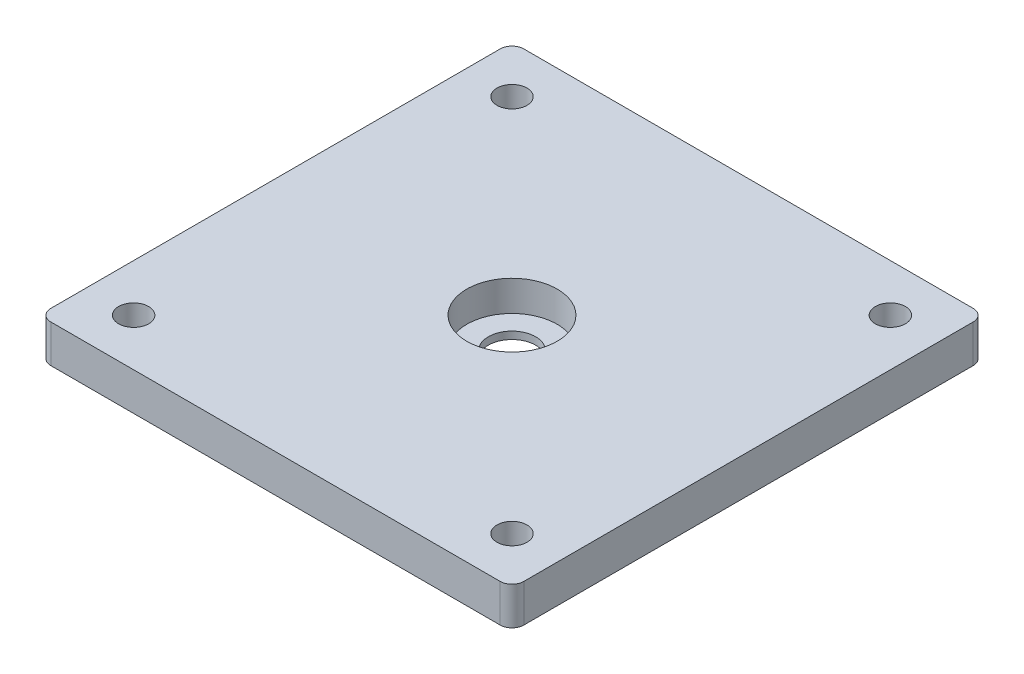
ISO-10303-21;
HEADER;
FILE_DESCRIPTION(('STEP AP214'),'2;1');
FILE_NAME('part.step','',(''),(''),'','','');
FILE_SCHEMA(('AUTOMOTIVE_DESIGN { 1 0 10303 214 1 1 1 1 }'));
ENDSEC;
DATA;
#1=APPLICATION_CONTEXT('core data for automotive mechanical design processes');
#2=APPLICATION_PROTOCOL_DEFINITION('international standard','automotive_design',2000,#1);
#3=PRODUCT_CONTEXT('',#1,'mechanical');
#4=PRODUCT('Part','Part','',(#3));
#5=PRODUCT_RELATED_PRODUCT_CATEGORY('part','',(#4));
#6=PRODUCT_DEFINITION_FORMATION('','',#4);
#7=PRODUCT_DEFINITION_CONTEXT('part definition',#1,'design');
#8=PRODUCT_DEFINITION('design','',#6,#7);
#9=PRODUCT_DEFINITION_SHAPE('','',#8);
#10=(LENGTH_UNIT() NAMED_UNIT(*) SI_UNIT(.MILLI.,.METRE.));
#11=(NAMED_UNIT(*) PLANE_ANGLE_UNIT() SI_UNIT($,.RADIAN.));
#12=(NAMED_UNIT(*) SI_UNIT($,.STERADIAN.) SOLID_ANGLE_UNIT());
#13=UNCERTAINTY_MEASURE_WITH_UNIT(LENGTH_MEASURE(1.E-05),#10,'distance_accuracy_value','');
#14=(GEOMETRIC_REPRESENTATION_CONTEXT(3) GLOBAL_UNCERTAINTY_ASSIGNED_CONTEXT((#13)) GLOBAL_UNIT_ASSIGNED_CONTEXT((#10,
#11,#12)) REPRESENTATION_CONTEXT('',''));
#15=CARTESIAN_POINT('',(0.,0.,0.));
#16=DIRECTION('',(0.,0.,1.));
#17=DIRECTION('',(1.,0.,0.));
#18=AXIS2_PLACEMENT_3D('',#15,#16,#17);
#19=CARTESIAN_POINT('',(-1.19904076738608,3.55,-2.75779376498803));
#20=DIRECTION('',(0.,1.,0.));
#21=DIRECTION('',(0.,0.,1.));
#22=AXIS2_PLACEMENT_3D('',#19,#20,#21);
#23=PLANE('',#22);
#24=CARTESIAN_POINT('',(-1.19904076738608,3.55,-2.75779376498803));
#25=DIRECTION('',(0.,1.,0.));
#26=DIRECTION('',(0.,0.,1.));
#27=AXIS2_PLACEMENT_3D('',#24,#25,#26);
#28=CIRCLE('',#27,5.);
#29=CARTESIAN_POINT('',(-1.19904076738608,3.55,2.24220623501198));
#30=VERTEX_POINT('',#29);
#31=EDGE_CURVE('E225',#30,#30,#28,.F.);
#32=ORIENTED_EDGE('',*,*,#31,.T.);
#33=EDGE_LOOP('',(#32));
#34=FACE_BOUND('',#33,.T.);
#35=CARTESIAN_POINT('',(-1.19904076738608,3.55,-2.75779376498803));
#36=DIRECTION('',(0.,1.,0.));
#37=DIRECTION('',(0.,0.,1.));
#38=AXIS2_PLACEMENT_3D('',#35,#36,#37);
#39=CIRCLE('',#38,9.5625);
#40=CARTESIAN_POINT('',(-1.19904076738608,3.55,6.80470623501197));
#41=VERTEX_POINT('',#40);
#42=EDGE_CURVE('E166',#41,#41,#39,.F.);
#43=ORIENTED_EDGE('',*,*,#42,.F.);
#44=EDGE_LOOP('',(#43));
#45=FACE_BOUND('',#44,.T.);
#46=ADVANCED_FACE('F57',(#34,#45),#23,.T.);
#47=CARTESIAN_POINT('',(-1.19904076738608,0.,-2.75779376498803));
#48=DIRECTION('',(0.,1.,0.));
#49=DIRECTION('',(0.,0.,1.));
#50=AXIS2_PLACEMENT_3D('',#47,#48,#49);
#51=CYLINDRICAL_SURFACE('',#50,5.);
#52=ORIENTED_EDGE('',*,*,#31,.F.);
#53=EDGE_LOOP('',(#52));
#54=FACE_BOUND('',#53,.T.);
#55=CARTESIAN_POINT('',(-1.19904076738608,2.,-2.75779376498803));
#56=DIRECTION('',(0.,-1.,0.));
#57=DIRECTION('',(0.,0.,-1.));
#58=AXIS2_PLACEMENT_3D('',#55,#56,#57);
#59=CIRCLE('',#58,5.);
#60=CARTESIAN_POINT('',(-1.19904076738608,2.,-7.75779376498803));
#61=VERTEX_POINT('',#60);
#62=EDGE_CURVE('E229',#61,#61,#59,.F.);
#63=ORIENTED_EDGE('',*,*,#62,.F.);
#64=EDGE_LOOP('',(#63));
#65=FACE_BOUND('',#64,.T.);
#66=ADVANCED_FACE('F238',(#54,#65),#51,.F.);
#67=CARTESIAN_POINT('',(48.8009592326139,10.,0.));
#68=DIRECTION('',(1.,0.,0.));
#69=DIRECTION('',(0.,0.,-1.));
#70=AXIS2_PLACEMENT_3D('',#67,#68,#69);
#71=PLANE('',#70);
#72=DIRECTION('',(0.,0.,1.));
#73=VECTOR('',#72,1.);
#74=CARTESIAN_POINT('',(48.8009592326139,10.,0.));
#75=LINE('',#74,#73);
#76=CARTESIAN_POINT('',(48.8009592326139,10.,-50.257793764988));
#77=VERTEX_POINT('',#76);
#78=CARTESIAN_POINT('',(48.8009592326139,10.,44.742206235012));
#79=VERTEX_POINT('',#78);
#80=EDGE_CURVE('E212',#77,#79,#75,.T.);
#81=ORIENTED_EDGE('',*,*,#80,.T.);
#82=DIRECTION('',(0.,1.,0.));
#83=VECTOR('',#82,1.);
#84=CARTESIAN_POINT('',(48.8009592326139,2.,44.742206235012));
#85=LINE('',#84,#83);
#86=CARTESIAN_POINT('',(48.8009592326139,2.,44.742206235012));
#87=VERTEX_POINT('',#86);
#88=EDGE_CURVE('E76',#79,#87,#85,.F.);
#89=ORIENTED_EDGE('',*,*,#88,.T.);
#90=DIRECTION('',(0.,0.,1.));
#91=VECTOR('',#90,1.);
#92=CARTESIAN_POINT('',(48.8009592326139,2.,-42.757793764988));
#93=LINE('',#92,#91);
#94=CARTESIAN_POINT('',(48.8009592326139,2.,-50.257793764988));
#95=VERTEX_POINT('',#94);
#96=EDGE_CURVE('E292',#95,#87,#93,.T.);
#97=ORIENTED_EDGE('',*,*,#96,.F.);
#98=DIRECTION('',(0.,1.,0.));
#99=VECTOR('',#98,1.);
#100=CARTESIAN_POINT('',(48.8009592326139,10.,-50.257793764988));
#101=LINE('',#100,#99);
#102=EDGE_CURVE('E143',#95,#77,#101,.T.);
#103=ORIENTED_EDGE('',*,*,#102,.T.);
#104=EDGE_LOOP('',(#81,#89,#97,#103));
#105=FACE_BOUND('',#104,.T.);
#106=ADVANCED_FACE('F246',(#105),#71,.T.);
#107=CARTESIAN_POINT('',(0.,10.,-52.757793764988));
#108=DIRECTION('',(0.,0.,-1.));
#109=DIRECTION('',(-1.,0.,0.));
#110=AXIS2_PLACEMENT_3D('',#107,#108,#109);
#111=PLANE('',#110);
#112=DIRECTION('',(1.,0.,0.));
#113=VECTOR('',#112,1.);
#114=CARTESIAN_POINT('',(0.,10.,-52.757793764988));
#115=LINE('',#114,#113);
#116=CARTESIAN_POINT('',(-48.6990407673861,10.,-52.757793764988));
#117=VERTEX_POINT('',#116);
#118=CARTESIAN_POINT('',(46.3009592326139,10.,-52.757793764988));
#119=VERTEX_POINT('',#118);
#120=EDGE_CURVE('E203',#117,#119,#115,.T.);
#121=ORIENTED_EDGE('',*,*,#120,.T.);
#122=DIRECTION('',(0.,1.,0.));
#123=VECTOR('',#122,1.);
#124=CARTESIAN_POINT('',(46.3009592326139,10.,-52.757793764988));
#125=LINE('',#124,#123);
#126=CARTESIAN_POINT('',(46.3009592326139,2.,-52.757793764988));
#127=VERTEX_POINT('',#126);
#128=EDGE_CURVE('E11',#119,#127,#125,.F.);
#129=ORIENTED_EDGE('',*,*,#128,.T.);
#130=DIRECTION('',(1.,0.,0.));
#131=VECTOR('',#130,1.);
#132=CARTESIAN_POINT('',(-41.199040767386,2.,-52.757793764988));
#133=LINE('',#132,#131);
#134=CARTESIAN_POINT('',(-48.6990407673861,2.,-52.757793764988));
#135=VERTEX_POINT('',#134);
#136=EDGE_CURVE('E155',#135,#127,#133,.T.);
#137=ORIENTED_EDGE('',*,*,#136,.F.);
#138=DIRECTION('',(0.,1.,0.));
#139=VECTOR('',#138,1.);
#140=CARTESIAN_POINT('',(-48.6990407673861,10.,-52.757793764988));
#141=LINE('',#140,#139);
#142=EDGE_CURVE('E66',#135,#117,#141,.T.);
#143=ORIENTED_EDGE('',*,*,#142,.T.);
#144=EDGE_LOOP('',(#121,#129,#137,#143));
#145=FACE_BOUND('',#144,.T.);
#146=ADVANCED_FACE('F202',(#145),#111,.T.);
#147=CARTESIAN_POINT('',(-51.1990407673861,10.,0.));
#148=DIRECTION('',(1.,0.,0.));
#149=DIRECTION('',(0.,0.,-1.));
#150=AXIS2_PLACEMENT_3D('',#147,#148,#149);
#151=PLANE('',#150);
#152=DIRECTION('',(0.,0.,-1.));
#153=VECTOR('',#152,1.);
#154=CARTESIAN_POINT('',(-51.1990407673861,2.,37.2422062350119));
#155=LINE('',#154,#153);
#156=CARTESIAN_POINT('',(-51.1990407673861,2.,44.742206235012));
#157=VERTEX_POINT('',#156);
#158=CARTESIAN_POINT('',(-51.1990407673861,2.,-50.257793764988));
#159=VERTEX_POINT('',#158);
#160=EDGE_CURVE('E135',#157,#159,#155,.T.);
#161=ORIENTED_EDGE('',*,*,#160,.F.);
#162=DIRECTION('',(0.,1.,0.));
#163=VECTOR('',#162,1.);
#164=CARTESIAN_POINT('',(-51.1990407673861,10.,44.742206235012));
#165=LINE('',#164,#163);
#166=CARTESIAN_POINT('',(-51.1990407673861,10.,44.742206235012));
#167=VERTEX_POINT('',#166);
#168=EDGE_CURVE('E150',#157,#167,#165,.T.);
#169=ORIENTED_EDGE('',*,*,#168,.T.);
#170=DIRECTION('',(0.,0.,1.));
#171=VECTOR('',#170,1.);
#172=CARTESIAN_POINT('',(-51.1990407673861,10.,0.));
#173=LINE('',#172,#171);
#174=CARTESIAN_POINT('',(-51.1990407673861,10.,-50.257793764988));
#175=VERTEX_POINT('',#174);
#176=EDGE_CURVE('E211',#175,#167,#173,.T.);
#177=ORIENTED_EDGE('',*,*,#176,.F.);
#178=DIRECTION('',(0.,1.,0.));
#179=VECTOR('',#178,1.);
#180=CARTESIAN_POINT('',(-51.1990407673861,2.,-50.257793764988));
#181=LINE('',#180,#179);
#182=EDGE_CURVE('E153',#175,#159,#181,.F.);
#183=ORIENTED_EDGE('',*,*,#182,.T.);
#184=EDGE_LOOP('',(#161,#169,#177,#183));
#185=FACE_BOUND('',#184,.T.);
#186=ADVANCED_FACE('F148',(#185),#151,.F.);
#187=CARTESIAN_POINT('',(0.,10.,47.242206235012));
#188=DIRECTION('',(0.,0.,-1.));
#189=DIRECTION('',(-1.,0.,0.));
#190=AXIS2_PLACEMENT_3D('',#187,#188,#189);
#191=PLANE('',#190);
#192=DIRECTION('',(1.,0.,0.));
#193=VECTOR('',#192,1.);
#194=CARTESIAN_POINT('',(0.,10.,47.242206235012));
#195=LINE('',#194,#193);
#196=CARTESIAN_POINT('',(-48.6990407673861,10.,47.242206235012));
#197=VERTEX_POINT('',#196);
#198=CARTESIAN_POINT('',(46.3009592326139,10.,47.242206235012));
#199=VERTEX_POINT('',#198);
#200=EDGE_CURVE('E216',#197,#199,#195,.T.);
#201=ORIENTED_EDGE('',*,*,#200,.F.);
#202=DIRECTION('',(0.,1.,0.));
#203=VECTOR('',#202,1.);
#204=CARTESIAN_POINT('',(-48.6990407673861,10.,47.242206235012));
#205=LINE('',#204,#203);
#206=CARTESIAN_POINT('',(-48.6990407673861,2.,47.242206235012));
#207=VERTEX_POINT('',#206);
#208=EDGE_CURVE('E181',#197,#207,#205,.F.);
#209=ORIENTED_EDGE('',*,*,#208,.T.);
#210=DIRECTION('',(-1.,0.,0.));
#211=VECTOR('',#210,1.);
#212=CARTESIAN_POINT('',(38.8009592326139,2.,47.242206235012));
#213=LINE('',#212,#211);
#214=CARTESIAN_POINT('',(46.3009592326139,2.,47.242206235012));
#215=VERTEX_POINT('',#214);
#216=EDGE_CURVE('E138',#215,#207,#213,.T.);
#217=ORIENTED_EDGE('',*,*,#216,.F.);
#218=DIRECTION('',(0.,1.,0.));
#219=VECTOR('',#218,1.);
#220=CARTESIAN_POINT('',(46.3009592326139,10.,47.242206235012));
#221=LINE('',#220,#219);
#222=EDGE_CURVE('E177',#215,#199,#221,.T.);
#223=ORIENTED_EDGE('',*,*,#222,.T.);
#224=EDGE_LOOP('',(#201,#209,#217,#223));
#225=FACE_BOUND('',#224,.T.);
#226=ADVANCED_FACE('F256',(#225),#191,.F.);
#227=CARTESIAN_POINT('',(-41.1990407673861,10.,-42.757793764988));
#228=DIRECTION('',(0.,-1.,0.));
#229=DIRECTION('',(0.,0.,-1.));
#230=AXIS2_PLACEMENT_3D('',#227,#228,#229);
#231=CYLINDRICAL_SURFACE('',#230,3.175);
#232=CARTESIAN_POINT('',(-41.1990407673861,10.,-42.757793764988));
#233=DIRECTION('',(0.,1.,0.));
#234=DIRECTION('',(0.,0.,1.));
#235=AXIS2_PLACEMENT_3D('',#232,#233,#234);
#236=CIRCLE('',#235,3.175);
#237=CARTESIAN_POINT('',(-41.1990407673861,10.,-39.582793764988));
#238=VERTEX_POINT('',#237);
#239=EDGE_CURVE('E218',#238,#238,#236,.T.);
#240=ORIENTED_EDGE('',*,*,#239,.T.);
#241=EDGE_LOOP('',(#240));
#242=FACE_BOUND('',#241,.T.);
#243=CARTESIAN_POINT('',(-41.1990407673861,2.,-42.757793764988));
#244=DIRECTION('',(0.,-1.,0.));
#245=DIRECTION('',(0.,0.,-1.));
#246=AXIS2_PLACEMENT_3D('',#243,#244,#245);
#247=CIRCLE('',#246,3.175);
#248=CARTESIAN_POINT('',(-41.1990407673861,2.,-45.932793764988));
#249=VERTEX_POINT('',#248);
#250=EDGE_CURVE('E317',#249,#249,#247,.T.);
#251=ORIENTED_EDGE('',*,*,#250,.T.);
#252=EDGE_LOOP('',(#251));
#253=FACE_BOUND('',#252,.T.);
#254=ADVANCED_FACE('F259',(#242,#253),#231,.F.);
#255=CARTESIAN_POINT('',(38.8009592326139,10.,-42.757793764988));
#256=DIRECTION('',(0.,-1.,0.));
#257=DIRECTION('',(0.,0.,-1.));
#258=AXIS2_PLACEMENT_3D('',#255,#256,#257);
#259=CYLINDRICAL_SURFACE('',#258,3.175);
#260=CARTESIAN_POINT('',(38.8009592326139,10.,-42.757793764988));
#261=DIRECTION('',(0.,1.,0.));
#262=DIRECTION('',(0.,0.,1.));
#263=AXIS2_PLACEMENT_3D('',#260,#261,#262);
#264=CIRCLE('',#263,3.175);
#265=CARTESIAN_POINT('',(38.8009592326139,10.,-39.582793764988));
#266=VERTEX_POINT('',#265);
#267=EDGE_CURVE('E331',#266,#266,#264,.T.);
#268=ORIENTED_EDGE('',*,*,#267,.T.);
#269=EDGE_LOOP('',(#268));
#270=FACE_BOUND('',#269,.T.);
#271=CARTESIAN_POINT('',(38.8009592326139,2.,-42.757793764988));
#272=DIRECTION('',(0.,-1.,0.));
#273=DIRECTION('',(0.,0.,-1.));
#274=AXIS2_PLACEMENT_3D('',#271,#272,#273);
#275=CIRCLE('',#274,3.175);
#276=CARTESIAN_POINT('',(38.8009592326139,2.,-45.932793764988));
#277=VERTEX_POINT('',#276);
#278=EDGE_CURVE('E313',#277,#277,#275,.T.);
#279=ORIENTED_EDGE('',*,*,#278,.T.);
#280=EDGE_LOOP('',(#279));
#281=FACE_BOUND('',#280,.T.);
#282=ADVANCED_FACE('F269',(#270,#281),#259,.F.);
#283=CARTESIAN_POINT('',(38.8009592326139,10.,37.242206235012));
#284=DIRECTION('',(0.,-1.,0.));
#285=DIRECTION('',(0.,0.,-1.));
#286=AXIS2_PLACEMENT_3D('',#283,#284,#285);
#287=CYLINDRICAL_SURFACE('',#286,3.175);
#288=CARTESIAN_POINT('',(38.8009592326139,10.,37.242206235012));
#289=DIRECTION('',(0.,1.,0.));
#290=DIRECTION('',(0.,0.,1.));
#291=AXIS2_PLACEMENT_3D('',#288,#289,#290);
#292=CIRCLE('',#291,3.175);
#293=CARTESIAN_POINT('',(38.8009592326139,10.,40.417206235012));
#294=VERTEX_POINT('',#293);
#295=EDGE_CURVE('E327',#294,#294,#292,.T.);
#296=ORIENTED_EDGE('',*,*,#295,.T.);
#297=EDGE_LOOP('',(#296));
#298=FACE_BOUND('',#297,.T.);
#299=CARTESIAN_POINT('',(38.8009592326139,2.,37.242206235012));
#300=DIRECTION('',(0.,-1.,0.));
#301=DIRECTION('',(0.,0.,-1.));
#302=AXIS2_PLACEMENT_3D('',#299,#300,#301);
#303=CIRCLE('',#302,3.175);
#304=CARTESIAN_POINT('',(38.8009592326139,2.,34.067206235012));
#305=VERTEX_POINT('',#304);
#306=EDGE_CURVE('E309',#305,#305,#303,.T.);
#307=ORIENTED_EDGE('',*,*,#306,.T.);
#308=EDGE_LOOP('',(#307));
#309=FACE_BOUND('',#308,.T.);
#310=ADVANCED_FACE('F273',(#298,#309),#287,.F.);
#311=CARTESIAN_POINT('',(-41.1990407673861,10.,37.242206235012));
#312=DIRECTION('',(0.,-1.,0.));
#313=DIRECTION('',(0.,0.,-1.));
#314=AXIS2_PLACEMENT_3D('',#311,#312,#313);
#315=CYLINDRICAL_SURFACE('',#314,3.175);
#316=CARTESIAN_POINT('',(-41.1990407673861,10.,37.242206235012));
#317=DIRECTION('',(0.,1.,0.));
#318=DIRECTION('',(0.,0.,1.));
#319=AXIS2_PLACEMENT_3D('',#316,#317,#318);
#320=CIRCLE('',#319,3.175);
#321=CARTESIAN_POINT('',(-41.1990407673861,10.,40.417206235012));
#322=VERTEX_POINT('',#321);
#323=EDGE_CURVE('E228',#322,#322,#320,.T.);
#324=ORIENTED_EDGE('',*,*,#323,.T.);
#325=EDGE_LOOP('',(#324));
#326=FACE_BOUND('',#325,.T.);
#327=CARTESIAN_POINT('',(-41.1990407673861,2.,37.242206235012));
#328=DIRECTION('',(0.,-1.,0.));
#329=DIRECTION('',(0.,0.,-1.));
#330=AXIS2_PLACEMENT_3D('',#327,#328,#329);
#331=CIRCLE('',#330,3.175);
#332=CARTESIAN_POINT('',(-41.1990407673861,2.,34.067206235012));
#333=VERTEX_POINT('',#332);
#334=EDGE_CURVE('E305',#333,#333,#331,.T.);
#335=ORIENTED_EDGE('',*,*,#334,.T.);
#336=EDGE_LOOP('',(#335));
#337=FACE_BOUND('',#336,.T.);
#338=ADVANCED_FACE('F254',(#326,#337),#315,.F.);
#339=CARTESIAN_POINT('',(0.,10.,0.));
#340=DIRECTION('',(0.,1.,0.));
#341=DIRECTION('',(0.,0.,1.));
#342=AXIS2_PLACEMENT_3D('',#339,#340,#341);
#343=PLANE('',#342);
#344=ORIENTED_EDGE('',*,*,#323,.F.);
#345=EDGE_LOOP('',(#344));
#346=FACE_BOUND('',#345,.T.);
#347=ORIENTED_EDGE('',*,*,#295,.F.);
#348=EDGE_LOOP('',(#347));
#349=FACE_BOUND('',#348,.T.);
#350=ORIENTED_EDGE('',*,*,#267,.F.);
#351=EDGE_LOOP('',(#350));
#352=FACE_BOUND('',#351,.T.);
#353=ORIENTED_EDGE('',*,*,#239,.F.);
#354=EDGE_LOOP('',(#353));
#355=FACE_BOUND('',#354,.T.);
#356=ORIENTED_EDGE('',*,*,#176,.T.);
#357=CARTESIAN_POINT('',(-48.6990407673861,10.,44.742206235012));
#358=DIRECTION('',(0.,1.,0.));
#359=DIRECTION('',(0.,0.,1.));
#360=AXIS2_PLACEMENT_3D('',#357,#358,#359);
#361=CIRCLE('',#360,2.5);
#362=EDGE_CURVE('E158',#167,#197,#361,.T.);
#363=ORIENTED_EDGE('',*,*,#362,.T.);
#364=ORIENTED_EDGE('',*,*,#200,.T.);
#365=CARTESIAN_POINT('',(46.3009592326139,10.,44.742206235012));
#366=DIRECTION('',(0.,1.,0.));
#367=DIRECTION('',(0.,0.,1.));
#368=AXIS2_PLACEMENT_3D('',#365,#366,#367);
#369=CIRCLE('',#368,2.5);
#370=EDGE_CURVE('E172',#199,#79,#369,.T.);
#371=ORIENTED_EDGE('',*,*,#370,.T.);
#372=ORIENTED_EDGE('',*,*,#80,.F.);
#373=CARTESIAN_POINT('',(46.3009592326139,10.,-50.257793764988));
#374=DIRECTION('',(0.,1.,0.));
#375=DIRECTION('',(0.,0.,1.));
#376=AXIS2_PLACEMENT_3D('',#373,#374,#375);
#377=CIRCLE('',#376,2.5);
#378=EDGE_CURVE('E164',#77,#119,#377,.T.);
#379=ORIENTED_EDGE('',*,*,#378,.T.);
#380=ORIENTED_EDGE('',*,*,#120,.F.);
#381=CARTESIAN_POINT('',(-48.6990407673861,10.,-50.257793764988));
#382=DIRECTION('',(0.,1.,0.));
#383=DIRECTION('',(0.,0.,1.));
#384=AXIS2_PLACEMENT_3D('',#381,#382,#383);
#385=CIRCLE('',#384,2.5);
#386=EDGE_CURVE('E160',#117,#175,#385,.T.);
#387=ORIENTED_EDGE('',*,*,#386,.T.);
#388=EDGE_LOOP('',(#356,#363,#364,#371,#372,#379,#380,#387));
#389=FACE_BOUND('',#388,.T.);
#390=CARTESIAN_POINT('',(-1.19904076738608,10.,-2.75779376498803));
#391=DIRECTION('',(0.,1.,0.));
#392=DIRECTION('',(0.,0.,1.));
#393=AXIS2_PLACEMENT_3D('',#390,#391,#392);
#394=CIRCLE('',#393,9.5625);
#395=CARTESIAN_POINT('',(-1.19904076738608,10.,6.80470623501197));
#396=VERTEX_POINT('',#395);
#397=EDGE_CURVE('E299',#396,#396,#394,.T.);
#398=ORIENTED_EDGE('',*,*,#397,.F.);
#399=EDGE_LOOP('',(#398));
#400=FACE_BOUND('',#399,.T.);
#401=ADVANCED_FACE('F207',(#346,#349,#352,#355,#389,#400),#343,.T.);
#402=CARTESIAN_POINT('',(38.8009592326139,2.,-42.757793764988));
#403=DIRECTION('',(0.,-1.,0.));
#404=DIRECTION('',(0.,0.,-1.));
#405=AXIS2_PLACEMENT_3D('',#402,#403,#404);
#406=PLANE('',#405);
#407=ORIENTED_EDGE('',*,*,#250,.F.);
#408=EDGE_LOOP('',(#407));
#409=FACE_BOUND('',#408,.T.);
#410=ORIENTED_EDGE('',*,*,#278,.F.);
#411=EDGE_LOOP('',(#410));
#412=FACE_BOUND('',#411,.T.);
#413=ORIENTED_EDGE('',*,*,#306,.F.);
#414=EDGE_LOOP('',(#413));
#415=FACE_BOUND('',#414,.T.);
#416=ORIENTED_EDGE('',*,*,#334,.F.);
#417=EDGE_LOOP('',(#416));
#418=FACE_BOUND('',#417,.T.);
#419=ORIENTED_EDGE('',*,*,#216,.T.);
#420=CARTESIAN_POINT('',(-48.6990407673861,2.,44.742206235012));
#421=DIRECTION('',(0.,-1.,0.));
#422=DIRECTION('',(0.,0.,-1.));
#423=AXIS2_PLACEMENT_3D('',#420,#421,#422);
#424=CIRCLE('',#423,2.5);
#425=EDGE_CURVE('E131',#207,#157,#424,.T.);
#426=ORIENTED_EDGE('',*,*,#425,.T.);
#427=ORIENTED_EDGE('',*,*,#160,.T.);
#428=CARTESIAN_POINT('',(-48.6990407673861,2.,-50.257793764988));
#429=DIRECTION('',(0.,-1.,0.));
#430=DIRECTION('',(0.,0.,-1.));
#431=AXIS2_PLACEMENT_3D('',#428,#429,#430);
#432=CIRCLE('',#431,2.5);
#433=EDGE_CURVE('E184',#159,#135,#432,.T.);
#434=ORIENTED_EDGE('',*,*,#433,.T.);
#435=ORIENTED_EDGE('',*,*,#136,.T.);
#436=CARTESIAN_POINT('',(46.3009592326139,2.,-50.257793764988));
#437=DIRECTION('',(0.,-1.,0.));
#438=DIRECTION('',(0.,0.,-1.));
#439=AXIS2_PLACEMENT_3D('',#436,#437,#438);
#440=CIRCLE('',#439,2.5);
#441=EDGE_CURVE('E85',#127,#95,#440,.T.);
#442=ORIENTED_EDGE('',*,*,#441,.T.);
#443=ORIENTED_EDGE('',*,*,#96,.T.);
#444=CARTESIAN_POINT('',(46.3009592326139,2.,44.742206235012));
#445=DIRECTION('',(0.,-1.,0.));
#446=DIRECTION('',(0.,0.,-1.));
#447=AXIS2_PLACEMENT_3D('',#444,#445,#446);
#448=CIRCLE('',#447,2.5);
#449=EDGE_CURVE('E144',#87,#215,#448,.T.);
#450=ORIENTED_EDGE('',*,*,#449,.T.);
#451=EDGE_LOOP('',(#419,#426,#427,#434,#435,#442,#443,#450));
#452=FACE_BOUND('',#451,.T.);
#453=ORIENTED_EDGE('',*,*,#62,.T.);
#454=EDGE_LOOP('',(#453));
#455=FACE_BOUND('',#454,.T.);
#456=ADVANCED_FACE('F133',(#409,#412,#415,#418,#452,#455),#406,.T.);
#457=CARTESIAN_POINT('',(-1.19904076738608,38.2842712474619,-2.75779376498803));
#458=DIRECTION('',(0.,-1.,0.));
#459=DIRECTION('',(0.,0.,-1.));
#460=AXIS2_PLACEMENT_3D('',#457,#458,#459);
#461=CYLINDRICAL_SURFACE('',#460,9.5625);
#462=ORIENTED_EDGE('',*,*,#42,.T.);
#463=EDGE_LOOP('',(#462));
#464=FACE_BOUND('',#463,.T.);
#465=ORIENTED_EDGE('',*,*,#397,.T.);
#466=EDGE_LOOP('',(#465));
#467=FACE_BOUND('',#466,.T.);
#468=ADVANCED_FACE('F234',(#464,#467),#461,.F.);
#469=CARTESIAN_POINT('',(-48.6990407673861,10.,44.742206235012));
#470=DIRECTION('',(0.,1.,0.));
#471=DIRECTION('',(0.,0.,1.));
#472=AXIS2_PLACEMENT_3D('',#469,#470,#471);
#473=CYLINDRICAL_SURFACE('',#472,2.5);
#474=ORIENTED_EDGE('',*,*,#425,.F.);
#475=ORIENTED_EDGE('',*,*,#208,.F.);
#476=ORIENTED_EDGE('',*,*,#362,.F.);
#477=ORIENTED_EDGE('',*,*,#168,.F.);
#478=EDGE_LOOP('',(#474,#475,#476,#477));
#479=FACE_BOUND('',#478,.T.);
#480=ADVANCED_FACE('F157',(#479),#473,.T.);
#481=CARTESIAN_POINT('',(46.3009592326139,10.,44.742206235012));
#482=DIRECTION('',(0.,-1.,0.));
#483=DIRECTION('',(0.,0.,-1.));
#484=AXIS2_PLACEMENT_3D('',#481,#482,#483);
#485=CYLINDRICAL_SURFACE('',#484,2.5);
#486=ORIENTED_EDGE('',*,*,#449,.F.);
#487=ORIENTED_EDGE('',*,*,#88,.F.);
#488=ORIENTED_EDGE('',*,*,#370,.F.);
#489=ORIENTED_EDGE('',*,*,#222,.F.);
#490=EDGE_LOOP('',(#486,#487,#488,#489));
#491=FACE_BOUND('',#490,.T.);
#492=ADVANCED_FACE('F282',(#491),#485,.T.);
#493=CARTESIAN_POINT('',(46.3009592326139,10.,-50.257793764988));
#494=DIRECTION('',(0.,1.,0.));
#495=DIRECTION('',(0.,0.,1.));
#496=AXIS2_PLACEMENT_3D('',#493,#494,#495);
#497=CYLINDRICAL_SURFACE('',#496,2.5);
#498=ORIENTED_EDGE('',*,*,#441,.F.);
#499=ORIENTED_EDGE('',*,*,#128,.F.);
#500=ORIENTED_EDGE('',*,*,#378,.F.);
#501=ORIENTED_EDGE('',*,*,#102,.F.);
#502=EDGE_LOOP('',(#498,#499,#500,#501));
#503=FACE_BOUND('',#502,.T.);
#504=ADVANCED_FACE('F284',(#503),#497,.T.);
#505=CARTESIAN_POINT('',(-48.6990407673861,10.,-50.257793764988));
#506=DIRECTION('',(0.,-1.,0.));
#507=DIRECTION('',(0.,0.,-1.));
#508=AXIS2_PLACEMENT_3D('',#505,#506,#507);
#509=CYLINDRICAL_SURFACE('',#508,2.5);
#510=ORIENTED_EDGE('',*,*,#433,.F.);
#511=ORIENTED_EDGE('',*,*,#182,.F.);
#512=ORIENTED_EDGE('',*,*,#386,.F.);
#513=ORIENTED_EDGE('',*,*,#142,.F.);
#514=EDGE_LOOP('',(#510,#511,#512,#513));
#515=FACE_BOUND('',#514,.T.);
#516=ADVANCED_FACE('F59',(#515),#509,.T.);
#517=CLOSED_SHELL('',(#46,#66,#106,#146,#186,#226,#254,#282,#310,#338,#401,#456,#468,#480,#492,
#504,#516));
#518=MANIFOLD_SOLID_BREP('B2',#517);
#519=ADVANCED_BREP_SHAPE_REPRESENTATION('',(#18,#518),#14);
#520=SHAPE_DEFINITION_REPRESENTATION(#9,#519);
ENDSEC;
END-ISO-10303-21;
